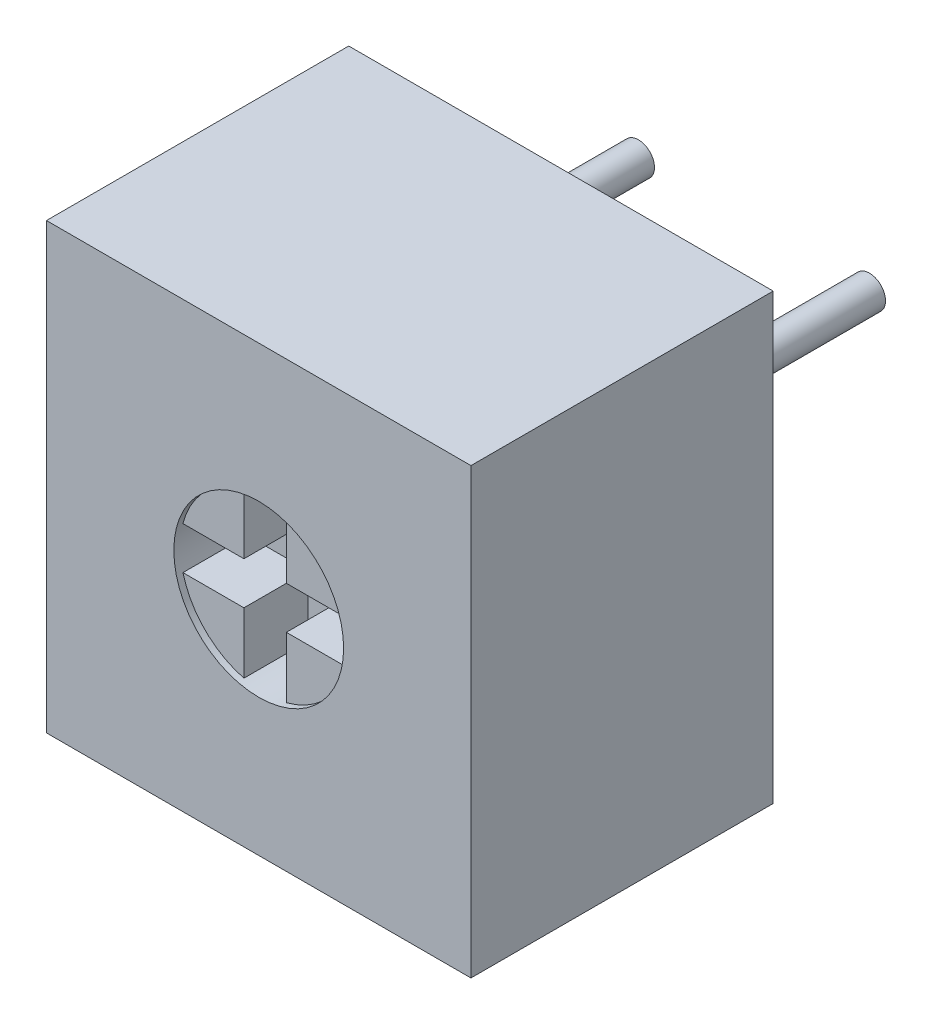
ISO-10303-21;
HEADER;
FILE_DESCRIPTION(('STEP AP214'),'2;1');
FILE_NAME('part.step','',(''),(''),'','','');
FILE_SCHEMA(('AUTOMOTIVE_DESIGN { 1 0 10303 214 1 1 1 1 }'));
ENDSEC;
DATA;
#1=APPLICATION_CONTEXT('core data for automotive mechanical design processes');
#2=APPLICATION_PROTOCOL_DEFINITION('international standard','automotive_design',2000,#1);
#3=PRODUCT_CONTEXT('',#1,'mechanical');
#4=PRODUCT('Part','Part','',(#3));
#5=PRODUCT_RELATED_PRODUCT_CATEGORY('part','',(#4));
#6=PRODUCT_DEFINITION_FORMATION('','',#4);
#7=PRODUCT_DEFINITION_CONTEXT('part definition',#1,'design');
#8=PRODUCT_DEFINITION('design','',#6,#7);
#9=PRODUCT_DEFINITION_SHAPE('','',#8);
#10=(LENGTH_UNIT() NAMED_UNIT(*) SI_UNIT(.MILLI.,.METRE.));
#11=(NAMED_UNIT(*) PLANE_ANGLE_UNIT() SI_UNIT($,.RADIAN.));
#12=(NAMED_UNIT(*) SI_UNIT($,.STERADIAN.) SOLID_ANGLE_UNIT());
#13=UNCERTAINTY_MEASURE_WITH_UNIT(LENGTH_MEASURE(1.E-05),#10,'distance_accuracy_value','');
#14=(GEOMETRIC_REPRESENTATION_CONTEXT(3) GLOBAL_UNCERTAINTY_ASSIGNED_CONTEXT((#13)) GLOBAL_UNIT_ASSIGNED_CONTEXT((#10,
#11,#12)) REPRESENTATION_CONTEXT('',''));
#15=CARTESIAN_POINT('',(0.,0.,0.));
#16=DIRECTION('',(0.,0.,1.));
#17=DIRECTION('',(1.,0.,0.));
#18=AXIS2_PLACEMENT_3D('',#15,#16,#17);
#19=CARTESIAN_POINT('',(0.,0.,4.6));
#20=DIRECTION('',(0.,0.,1.));
#21=DIRECTION('',(1.,0.,0.));
#22=AXIS2_PLACEMENT_3D('',#19,#20,#21);
#23=PLANE('',#22);
#24=DIRECTION('',(0.,-1.,0.));
#25=VECTOR('',#24,1.);
#26=CARTESIAN_POINT('',(-0.33,1.27808450424845,4.6));
#27=LINE('',#26,#25);
#28=CARTESIAN_POINT('',(-0.33,1.27808450424845,4.6));
#29=VERTEX_POINT('',#28);
#30=CARTESIAN_POINT('',(-0.33,0.33,4.6));
#31=VERTEX_POINT('',#30);
#32=EDGE_CURVE('E238',#29,#31,#27,.T.);
#33=ORIENTED_EDGE('',*,*,#32,.F.);
#34=CARTESIAN_POINT('',(0.,0.,4.6));
#35=DIRECTION('',(0.,0.,1.));
#36=DIRECTION('',(1.,0.,0.));
#37=AXIS2_PLACEMENT_3D('',#34,#35,#36);
#38=CIRCLE('',#37,1.32);
#39=CARTESIAN_POINT('',(-1.27808450424845,0.33,4.6));
#40=VERTEX_POINT('',#39);
#41=EDGE_CURVE('E171',#29,#40,#38,.T.);
#42=ORIENTED_EDGE('',*,*,#41,.T.);
#43=DIRECTION('',(-1.,0.,0.));
#44=VECTOR('',#43,1.);
#45=CARTESIAN_POINT('',(-0.33,0.33,4.6));
#46=LINE('',#45,#44);
#47=EDGE_CURVE('E241',#31,#40,#46,.T.);
#48=ORIENTED_EDGE('',*,*,#47,.F.);
#49=EDGE_LOOP('',(#33,#42,#48));
#50=FACE_BOUND('',#49,.T.);
#51=ADVANCED_FACE('F38',(#50),#23,.T.);
#52=DIRECTION('',(1.,0.,0.));
#53=VECTOR('',#52,1.);
#54=CARTESIAN_POINT('',(-1.27808450424845,-0.33,4.6));
#55=LINE('',#54,#53);
#56=CARTESIAN_POINT('',(-1.27808450424845,-0.33,4.6));
#57=VERTEX_POINT('',#56);
#58=CARTESIAN_POINT('',(-0.33,-0.33,4.6));
#59=VERTEX_POINT('',#58);
#60=EDGE_CURVE('E245',#57,#59,#55,.T.);
#61=ORIENTED_EDGE('',*,*,#60,.F.);
#62=CARTESIAN_POINT('',(-0.33,-1.27808450424845,4.6));
#63=VERTEX_POINT('',#62);
#64=EDGE_CURVE('E406',#57,#63,#38,.T.);
#65=ORIENTED_EDGE('',*,*,#64,.T.);
#66=DIRECTION('',(0.,-1.,0.));
#67=VECTOR('',#66,1.);
#68=CARTESIAN_POINT('',(-0.33,-0.33,4.6));
#69=LINE('',#68,#67);
#70=EDGE_CURVE('E249',#59,#63,#69,.T.);
#71=ORIENTED_EDGE('',*,*,#70,.F.);
#72=EDGE_LOOP('',(#61,#65,#71));
#73=FACE_BOUND('',#72,.T.);
#74=ADVANCED_FACE('F373',(#73),#23,.T.);
#75=DIRECTION('',(0.,1.,0.));
#76=VECTOR('',#75,1.);
#77=CARTESIAN_POINT('',(0.33,-1.27808450424845,4.6));
#78=LINE('',#77,#76);
#79=CARTESIAN_POINT('',(0.33,-1.27808450424845,4.6));
#80=VERTEX_POINT('',#79);
#81=CARTESIAN_POINT('',(0.33,-0.33,4.6));
#82=VERTEX_POINT('',#81);
#83=EDGE_CURVE('E253',#80,#82,#78,.T.);
#84=ORIENTED_EDGE('',*,*,#83,.F.);
#85=CARTESIAN_POINT('',(1.27808450424845,-0.33,4.6));
#86=VERTEX_POINT('',#85);
#87=EDGE_CURVE('E300',#80,#86,#38,.T.);
#88=ORIENTED_EDGE('',*,*,#87,.T.);
#89=DIRECTION('',(1.,0.,0.));
#90=VECTOR('',#89,1.);
#91=CARTESIAN_POINT('',(0.33,-0.33,4.6));
#92=LINE('',#91,#90);
#93=EDGE_CURVE('E257',#82,#86,#92,.T.);
#94=ORIENTED_EDGE('',*,*,#93,.F.);
#95=EDGE_LOOP('',(#84,#88,#94));
#96=FACE_BOUND('',#95,.T.);
#97=ADVANCED_FACE('F371',(#96),#23,.T.);
#98=CARTESIAN_POINT('',(3.3,-3.45,4.7));
#99=DIRECTION('',(-1.,0.,0.));
#100=DIRECTION('',(0.,0.,1.));
#101=AXIS2_PLACEMENT_3D('',#98,#99,#100);
#102=PLANE('',#101);
#103=DIRECTION('',(0.,1.,0.));
#104=VECTOR('',#103,1.);
#105=CARTESIAN_POINT('',(3.3,-3.45,0.));
#106=LINE('',#105,#104);
#107=CARTESIAN_POINT('',(3.3,-3.45,0.));
#108=VERTEX_POINT('',#107);
#109=CARTESIAN_POINT('',(3.3,3.45,0.));
#110=VERTEX_POINT('',#109);
#111=EDGE_CURVE('E299',#108,#110,#106,.T.);
#112=ORIENTED_EDGE('',*,*,#111,.T.);
#113=DIRECTION('',(0.,0.,-1.));
#114=VECTOR('',#113,1.);
#115=CARTESIAN_POINT('',(3.3,3.45,4.7));
#116=LINE('',#115,#114);
#117=CARTESIAN_POINT('',(3.3,3.45,4.7));
#118=VERTEX_POINT('',#117);
#119=EDGE_CURVE('E334',#118,#110,#116,.T.);
#120=ORIENTED_EDGE('',*,*,#119,.F.);
#121=DIRECTION('',(0.,1.,0.));
#122=VECTOR('',#121,1.);
#123=CARTESIAN_POINT('',(3.3,-3.45,4.7));
#124=LINE('',#123,#122);
#125=CARTESIAN_POINT('',(3.3,-3.45,4.7));
#126=VERTEX_POINT('',#125);
#127=EDGE_CURVE('E304',#126,#118,#124,.T.);
#128=ORIENTED_EDGE('',*,*,#127,.F.);
#129=DIRECTION('',(0.,0.,-1.));
#130=VECTOR('',#129,1.);
#131=CARTESIAN_POINT('',(3.3,-3.45,4.7));
#132=LINE('',#131,#130);
#133=EDGE_CURVE('E314',#126,#108,#132,.T.);
#134=ORIENTED_EDGE('',*,*,#133,.T.);
#135=EDGE_LOOP('',(#112,#120,#128,#134));
#136=FACE_BOUND('',#135,.T.);
#137=ADVANCED_FACE('F40',(#136),#102,.F.);
#138=CARTESIAN_POINT('',(-3.3,3.45,4.7));
#139=DIRECTION('',(0.,-1.,0.));
#140=DIRECTION('',(0.,0.,-1.));
#141=AXIS2_PLACEMENT_3D('',#138,#139,#140);
#142=PLANE('',#141);
#143=DIRECTION('',(-1.,0.,0.));
#144=VECTOR('',#143,1.);
#145=CARTESIAN_POINT('',(-3.3,3.45,0.));
#146=LINE('',#145,#144);
#147=CARTESIAN_POINT('',(-3.3,3.45,0.));
#148=VERTEX_POINT('',#147);
#149=EDGE_CURVE('E318',#110,#148,#146,.T.);
#150=ORIENTED_EDGE('',*,*,#149,.T.);
#151=DIRECTION('',(0.,0.,-1.));
#152=VECTOR('',#151,1.);
#153=CARTESIAN_POINT('',(-3.3,3.45,4.7));
#154=LINE('',#153,#152);
#155=CARTESIAN_POINT('',(-3.3,3.45,4.7));
#156=VERTEX_POINT('',#155);
#157=EDGE_CURVE('E331',#156,#148,#154,.T.);
#158=ORIENTED_EDGE('',*,*,#157,.F.);
#159=DIRECTION('',(-1.,0.,0.));
#160=VECTOR('',#159,1.);
#161=CARTESIAN_POINT('',(-3.3,3.45,4.7));
#162=LINE('',#161,#160);
#163=EDGE_CURVE('E92',#118,#156,#162,.T.);
#164=ORIENTED_EDGE('',*,*,#163,.F.);
#165=ORIENTED_EDGE('',*,*,#119,.T.);
#166=EDGE_LOOP('',(#150,#158,#164,#165));
#167=FACE_BOUND('',#166,.T.);
#168=ADVANCED_FACE('F364',(#167),#142,.F.);
#169=CARTESIAN_POINT('',(-3.3,-3.45,4.7));
#170=DIRECTION('',(1.,0.,0.));
#171=DIRECTION('',(0.,0.,-1.));
#172=AXIS2_PLACEMENT_3D('',#169,#170,#171);
#173=PLANE('',#172);
#174=DIRECTION('',(0.,-1.,0.));
#175=VECTOR('',#174,1.);
#176=CARTESIAN_POINT('',(-3.3,-3.45,0.));
#177=LINE('',#176,#175);
#178=CARTESIAN_POINT('',(-3.3,-3.45,0.));
#179=VERTEX_POINT('',#178);
#180=EDGE_CURVE('E321',#148,#179,#177,.T.);
#181=ORIENTED_EDGE('',*,*,#180,.T.);
#182=DIRECTION('',(0.,0.,-1.));
#183=VECTOR('',#182,1.);
#184=CARTESIAN_POINT('',(-3.3,-3.45,4.7));
#185=LINE('',#184,#183);
#186=CARTESIAN_POINT('',(-3.3,-3.45,4.7));
#187=VERTEX_POINT('',#186);
#188=EDGE_CURVE('E328',#187,#179,#185,.T.);
#189=ORIENTED_EDGE('',*,*,#188,.F.);
#190=DIRECTION('',(0.,-1.,0.));
#191=VECTOR('',#190,1.);
#192=CARTESIAN_POINT('',(-3.3,-3.45,4.7));
#193=LINE('',#192,#191);
#194=EDGE_CURVE('E309',#156,#187,#193,.T.);
#195=ORIENTED_EDGE('',*,*,#194,.F.);
#196=ORIENTED_EDGE('',*,*,#157,.T.);
#197=EDGE_LOOP('',(#181,#189,#195,#196));
#198=FACE_BOUND('',#197,.T.);
#199=ADVANCED_FACE('F363',(#198),#173,.F.);
#200=CARTESIAN_POINT('',(-3.3,-3.45,4.7));
#201=DIRECTION('',(0.,1.,0.));
#202=DIRECTION('',(0.,0.,1.));
#203=AXIS2_PLACEMENT_3D('',#200,#201,#202);
#204=PLANE('',#203);
#205=DIRECTION('',(1.,0.,0.));
#206=VECTOR('',#205,1.);
#207=CARTESIAN_POINT('',(-3.3,-3.45,0.));
#208=LINE('',#207,#206);
#209=EDGE_CURVE('E84',#179,#108,#208,.T.);
#210=ORIENTED_EDGE('',*,*,#209,.T.);
#211=ORIENTED_EDGE('',*,*,#133,.F.);
#212=DIRECTION('',(1.,0.,0.));
#213=VECTOR('',#212,1.);
#214=CARTESIAN_POINT('',(-3.3,-3.45,4.7));
#215=LINE('',#214,#213);
#216=EDGE_CURVE('E63',#187,#126,#215,.T.);
#217=ORIENTED_EDGE('',*,*,#216,.F.);
#218=ORIENTED_EDGE('',*,*,#188,.T.);
#219=EDGE_LOOP('',(#210,#211,#217,#218));
#220=FACE_BOUND('',#219,.T.);
#221=ADVANCED_FACE('F359',(#220),#204,.F.);
#222=CARTESIAN_POINT('',(0.,0.,4.7));
#223=DIRECTION('',(0.,0.,-1.));
#224=DIRECTION('',(-1.,0.,0.));
#225=AXIS2_PLACEMENT_3D('',#222,#223,#224);
#226=PLANE('',#225);
#227=CARTESIAN_POINT('',(0.,0.,4.7));
#228=DIRECTION('',(0.,0.,1.));
#229=DIRECTION('',(1.,0.,0.));
#230=AXIS2_PLACEMENT_3D('',#227,#228,#229);
#231=CIRCLE('',#230,1.32);
#232=CARTESIAN_POINT('',(1.32,0.,4.7));
#233=VERTEX_POINT('',#232);
#234=EDGE_CURVE('E266',#233,#233,#231,.T.);
#235=ORIENTED_EDGE('',*,*,#234,.F.);
#236=EDGE_LOOP('',(#235));
#237=FACE_BOUND('',#236,.T.);
#238=ORIENTED_EDGE('',*,*,#127,.T.);
#239=ORIENTED_EDGE('',*,*,#163,.T.);
#240=ORIENTED_EDGE('',*,*,#194,.T.);
#241=ORIENTED_EDGE('',*,*,#216,.T.);
#242=EDGE_LOOP('',(#238,#239,#240,#241));
#243=FACE_BOUND('',#242,.T.);
#244=ADVANCED_FACE('F349',(#237,#243),#226,.F.);
#245=CARTESIAN_POINT('',(0.,0.,0.));
#246=DIRECTION('',(0.,0.,-1.));
#247=DIRECTION('',(-1.,0.,0.));
#248=AXIS2_PLACEMENT_3D('',#245,#246,#247);
#249=PLANE('',#248);
#250=CARTESIAN_POINT('',(0.,-0.609999999999998,0.));
#251=DIRECTION('',(0.,0.,-1.));
#252=DIRECTION('',(-1.,0.,0.));
#253=AXIS2_PLACEMENT_3D('',#250,#251,#252);
#254=CIRCLE('',#253,0.25);
#255=CARTESIAN_POINT('',(-0.25,-0.609999999999998,0.));
#256=VERTEX_POINT('',#255);
#257=EDGE_CURVE('E11',#256,#256,#254,.T.);
#258=ORIENTED_EDGE('',*,*,#257,.F.);
#259=EDGE_LOOP('',(#258));
#260=FACE_BOUND('',#259,.T.);
#261=CARTESIAN_POINT('',(-1.79605,1.19,0.));
#262=DIRECTION('',(0.,0.,-1.));
#263=DIRECTION('',(-1.,0.,0.));
#264=AXIS2_PLACEMENT_3D('',#261,#262,#263);
#265=CIRCLE('',#264,0.25);
#266=CARTESIAN_POINT('',(-2.04605,1.19,0.));
#267=VERTEX_POINT('',#266);
#268=EDGE_CURVE('E47',#267,#267,#265,.T.);
#269=ORIENTED_EDGE('',*,*,#268,.F.);
#270=EDGE_LOOP('',(#269));
#271=FACE_BOUND('',#270,.T.);
#272=CARTESIAN_POINT('',(1.79605,1.19,0.));
#273=DIRECTION('',(0.,0.,-1.));
#274=DIRECTION('',(-1.,0.,0.));
#275=AXIS2_PLACEMENT_3D('',#272,#273,#274);
#276=CIRCLE('',#275,0.25);
#277=CARTESIAN_POINT('',(1.54605,1.19,0.));
#278=VERTEX_POINT('',#277);
#279=EDGE_CURVE('E337',#278,#278,#276,.T.);
#280=ORIENTED_EDGE('',*,*,#279,.F.);
#281=EDGE_LOOP('',(#280));
#282=FACE_BOUND('',#281,.T.);
#283=ORIENTED_EDGE('',*,*,#111,.F.);
#284=ORIENTED_EDGE('',*,*,#209,.F.);
#285=ORIENTED_EDGE('',*,*,#180,.F.);
#286=ORIENTED_EDGE('',*,*,#149,.F.);
#287=EDGE_LOOP('',(#283,#284,#285,#286));
#288=FACE_BOUND('',#287,.T.);
#289=ADVANCED_FACE('F346',(#260,#271,#282,#288),#249,.T.);
#290=CARTESIAN_POINT('',(0.,0.,4.6));
#291=DIRECTION('',(0.,0.,1.));
#292=DIRECTION('',(1.,0.,0.));
#293=AXIS2_PLACEMENT_3D('',#290,#291,#292);
#294=CYLINDRICAL_SURFACE('',#293,1.32);
#295=CARTESIAN_POINT('',(1.27808450424845,0.33,4.6));
#296=VERTEX_POINT('',#295);
#297=CARTESIAN_POINT('',(0.33,1.27808450424845,4.6));
#298=VERTEX_POINT('',#297);
#299=EDGE_CURVE('E295',#296,#298,#38,.T.);
#300=ORIENTED_EDGE('',*,*,#299,.F.);
#301=DIRECTION('',(0.,0.,1.));
#302=VECTOR('',#301,1.);
#303=CARTESIAN_POINT('',(1.27808450424845,0.33,3.6));
#304=LINE('',#303,#302);
#305=CARTESIAN_POINT('',(1.27808450424845,0.33,3.6));
#306=VERTEX_POINT('',#305);
#307=EDGE_CURVE('E270',#306,#296,#304,.T.);
#308=ORIENTED_EDGE('',*,*,#307,.F.);
#309=CARTESIAN_POINT('',(0.,0.,3.6));
#310=DIRECTION('',(0.,0.,1.));
#311=DIRECTION('',(-1.,0.,0.));
#312=AXIS2_PLACEMENT_3D('',#309,#310,#311);
#313=CIRCLE('',#312,1.32);
#314=CARTESIAN_POINT('',(1.27808450424845,-0.33,3.6));
#315=VERTEX_POINT('',#314);
#316=EDGE_CURVE('E229',#315,#306,#313,.T.);
#317=ORIENTED_EDGE('',*,*,#316,.F.);
#318=DIRECTION('',(0.,0.,1.));
#319=VECTOR('',#318,1.);
#320=CARTESIAN_POINT('',(1.27808450424845,-0.33,3.6));
#321=LINE('',#320,#319);
#322=EDGE_CURVE('E273',#315,#86,#321,.T.);
#323=ORIENTED_EDGE('',*,*,#322,.T.);
#324=ORIENTED_EDGE('',*,*,#87,.F.);
#325=DIRECTION('',(0.,0.,1.));
#326=VECTOR('',#325,1.);
#327=CARTESIAN_POINT('',(0.33,-1.27808450424845,3.6));
#328=LINE('',#327,#326);
#329=CARTESIAN_POINT('',(0.33,-1.27808450424845,3.6));
#330=VERTEX_POINT('',#329);
#331=EDGE_CURVE('E279',#330,#80,#328,.T.);
#332=ORIENTED_EDGE('',*,*,#331,.F.);
#333=CARTESIAN_POINT('',(0.,0.,3.6));
#334=DIRECTION('',(0.,0.,1.));
#335=DIRECTION('',(-1.,0.,0.));
#336=AXIS2_PLACEMENT_3D('',#333,#334,#335);
#337=CIRCLE('',#336,1.32);
#338=CARTESIAN_POINT('',(-0.33,-1.27808450424845,3.6));
#339=VERTEX_POINT('',#338);
#340=EDGE_CURVE('E217',#339,#330,#337,.T.);
#341=ORIENTED_EDGE('',*,*,#340,.F.);
#342=DIRECTION('',(0.,0.,1.));
#343=VECTOR('',#342,1.);
#344=CARTESIAN_POINT('',(-0.33,-1.27808450424845,3.6));
#345=LINE('',#344,#343);
#346=EDGE_CURVE('E282',#339,#63,#345,.T.);
#347=ORIENTED_EDGE('',*,*,#346,.T.);
#348=ORIENTED_EDGE('',*,*,#64,.F.);
#349=DIRECTION('',(0.,0.,1.));
#350=VECTOR('',#349,1.);
#351=CARTESIAN_POINT('',(-1.27808450424845,-0.33,3.6));
#352=LINE('',#351,#350);
#353=CARTESIAN_POINT('',(-1.27808450424845,-0.33,3.6));
#354=VERTEX_POINT('',#353);
#355=EDGE_CURVE('E287',#354,#57,#352,.T.);
#356=ORIENTED_EDGE('',*,*,#355,.F.);
#357=CARTESIAN_POINT('',(0.,0.,3.6));
#358=DIRECTION('',(0.,0.,1.));
#359=DIRECTION('',(-1.,0.,0.));
#360=AXIS2_PLACEMENT_3D('',#357,#358,#359);
#361=CIRCLE('',#360,1.32);
#362=CARTESIAN_POINT('',(-1.27808450424845,0.33,3.6));
#363=VERTEX_POINT('',#362);
#364=EDGE_CURVE('E205',#363,#354,#361,.T.);
#365=ORIENTED_EDGE('',*,*,#364,.F.);
#366=DIRECTION('',(0.,0.,1.));
#367=VECTOR('',#366,1.);
#368=CARTESIAN_POINT('',(-1.27808450424845,0.33,3.6));
#369=LINE('',#368,#367);
#370=EDGE_CURVE('E290',#363,#40,#369,.T.);
#371=ORIENTED_EDGE('',*,*,#370,.T.);
#372=ORIENTED_EDGE('',*,*,#41,.F.);
#373=DIRECTION('',(0.,0.,1.));
#374=VECTOR('',#373,1.);
#375=CARTESIAN_POINT('',(-0.33,1.27808450424845,3.6));
#376=LINE('',#375,#374);
#377=CARTESIAN_POINT('',(-0.33,1.27808450424845,3.6));
#378=VERTEX_POINT('',#377);
#379=EDGE_CURVE('E162',#378,#29,#376,.T.);
#380=ORIENTED_EDGE('',*,*,#379,.F.);
#381=CARTESIAN_POINT('',(0.,0.,3.6));
#382=DIRECTION('',(0.,0.,1.));
#383=DIRECTION('',(-1.,0.,0.));
#384=AXIS2_PLACEMENT_3D('',#381,#382,#383);
#385=CIRCLE('',#384,1.32);
#386=CARTESIAN_POINT('',(0.33,1.27808450424845,3.6));
#387=VERTEX_POINT('',#386);
#388=EDGE_CURVE('E168',#387,#378,#385,.T.);
#389=ORIENTED_EDGE('',*,*,#388,.F.);
#390=DIRECTION('',(0.,0.,1.));
#391=VECTOR('',#390,1.);
#392=CARTESIAN_POINT('',(0.33,1.27808450424845,3.6));
#393=LINE('',#392,#391);
#394=EDGE_CURVE('E263',#387,#298,#393,.T.);
#395=ORIENTED_EDGE('',*,*,#394,.T.);
#396=EDGE_LOOP('',(#300,#308,#317,#323,#324,#332,#341,#347,#348,#356,#365,#371,#372,#380,#389,#395));
#397=FACE_BOUND('',#396,.T.);
#398=ORIENTED_EDGE('',*,*,#234,.T.);
#399=EDGE_LOOP('',(#398));
#400=FACE_BOUND('',#399,.T.);
#401=ADVANCED_FACE('F165',(#397,#400),#294,.F.);
#402=DIRECTION('',(-1.,0.,0.));
#403=VECTOR('',#402,1.);
#404=CARTESIAN_POINT('',(1.27808450424845,0.33,4.6));
#405=LINE('',#404,#403);
#406=CARTESIAN_POINT('',(0.33,0.33,4.6));
#407=VERTEX_POINT('',#406);
#408=EDGE_CURVE('E54',#296,#407,#405,.T.);
#409=ORIENTED_EDGE('',*,*,#408,.F.);
#410=ORIENTED_EDGE('',*,*,#299,.T.);
#411=DIRECTION('',(0.,1.,0.));
#412=VECTOR('',#411,1.);
#413=CARTESIAN_POINT('',(0.33,0.33,4.6));
#414=LINE('',#413,#412);
#415=EDGE_CURVE('E192',#407,#298,#414,.T.);
#416=ORIENTED_EDGE('',*,*,#415,.F.);
#417=EDGE_LOOP('',(#409,#410,#416));
#418=FACE_BOUND('',#417,.T.);
#419=ADVANCED_FACE('F376',(#418),#23,.T.);
#420=CARTESIAN_POINT('',(0.33,0.33,3.6));
#421=DIRECTION('',(1.,0.,0.));
#422=DIRECTION('',(0.,0.,-1.));
#423=AXIS2_PLACEMENT_3D('',#420,#421,#422);
#424=PLANE('',#423);
#425=ORIENTED_EDGE('',*,*,#415,.T.);
#426=ORIENTED_EDGE('',*,*,#394,.F.);
#427=DIRECTION('',(0.,1.,0.));
#428=VECTOR('',#427,1.);
#429=CARTESIAN_POINT('',(0.33,0.33,3.6));
#430=LINE('',#429,#428);
#431=CARTESIAN_POINT('',(0.33,0.33,3.6));
#432=VERTEX_POINT('',#431);
#433=EDGE_CURVE('E177',#432,#387,#430,.T.);
#434=ORIENTED_EDGE('',*,*,#433,.F.);
#435=DIRECTION('',(0.,0.,1.));
#436=VECTOR('',#435,1.);
#437=CARTESIAN_POINT('',(0.33,0.33,3.6));
#438=LINE('',#437,#436);
#439=EDGE_CURVE('E267',#432,#407,#438,.T.);
#440=ORIENTED_EDGE('',*,*,#439,.T.);
#441=EDGE_LOOP('',(#425,#426,#434,#440));
#442=FACE_BOUND('',#441,.T.);
#443=ADVANCED_FACE('F384',(#442),#424,.F.);
#444=CARTESIAN_POINT('',(1.27808450424845,0.33,3.6));
#445=DIRECTION('',(0.,1.,0.));
#446=DIRECTION('',(0.,0.,1.));
#447=AXIS2_PLACEMENT_3D('',#444,#445,#446);
#448=PLANE('',#447);
#449=ORIENTED_EDGE('',*,*,#408,.T.);
#450=ORIENTED_EDGE('',*,*,#439,.F.);
#451=DIRECTION('',(-1.,0.,0.));
#452=VECTOR('',#451,1.);
#453=CARTESIAN_POINT('',(1.27808450424845,0.33,3.6));
#454=LINE('',#453,#452);
#455=EDGE_CURVE('E233',#306,#432,#454,.T.);
#456=ORIENTED_EDGE('',*,*,#455,.F.);
#457=ORIENTED_EDGE('',*,*,#307,.T.);
#458=EDGE_LOOP('',(#449,#450,#456,#457));
#459=FACE_BOUND('',#458,.T.);
#460=ADVANCED_FACE('F390',(#459),#448,.F.);
#461=CARTESIAN_POINT('',(0.33,-0.33,3.6));
#462=DIRECTION('',(0.,-1.,0.));
#463=DIRECTION('',(0.,0.,-1.));
#464=AXIS2_PLACEMENT_3D('',#461,#462,#463);
#465=PLANE('',#464);
#466=ORIENTED_EDGE('',*,*,#93,.T.);
#467=ORIENTED_EDGE('',*,*,#322,.F.);
#468=DIRECTION('',(1.,0.,0.));
#469=VECTOR('',#468,1.);
#470=CARTESIAN_POINT('',(0.33,-0.33,3.6));
#471=LINE('',#470,#469);
#472=CARTESIAN_POINT('',(0.33,-0.33,3.6));
#473=VERTEX_POINT('',#472);
#474=EDGE_CURVE('E225',#473,#315,#471,.T.);
#475=ORIENTED_EDGE('',*,*,#474,.F.);
#476=DIRECTION('',(0.,0.,1.));
#477=VECTOR('',#476,1.);
#478=CARTESIAN_POINT('',(0.33,-0.33,3.6));
#479=LINE('',#478,#477);
#480=EDGE_CURVE('E276',#473,#82,#479,.T.);
#481=ORIENTED_EDGE('',*,*,#480,.T.);
#482=EDGE_LOOP('',(#466,#467,#475,#481));
#483=FACE_BOUND('',#482,.T.);
#484=ADVANCED_FACE('F426',(#483),#465,.F.);
#485=CARTESIAN_POINT('',(0.33,-1.27808450424845,3.6));
#486=DIRECTION('',(1.,0.,0.));
#487=DIRECTION('',(0.,0.,-1.));
#488=AXIS2_PLACEMENT_3D('',#485,#486,#487);
#489=PLANE('',#488);
#490=ORIENTED_EDGE('',*,*,#83,.T.);
#491=ORIENTED_EDGE('',*,*,#480,.F.);
#492=DIRECTION('',(0.,1.,0.));
#493=VECTOR('',#492,1.);
#494=CARTESIAN_POINT('',(0.33,-1.27808450424845,3.6));
#495=LINE('',#494,#493);
#496=EDGE_CURVE('E221',#330,#473,#495,.T.);
#497=ORIENTED_EDGE('',*,*,#496,.F.);
#498=ORIENTED_EDGE('',*,*,#331,.T.);
#499=EDGE_LOOP('',(#490,#491,#497,#498));
#500=FACE_BOUND('',#499,.T.);
#501=ADVANCED_FACE('F424',(#500),#489,.F.);
#502=CARTESIAN_POINT('',(-0.33,-0.33,3.6));
#503=DIRECTION('',(-1.,0.,0.));
#504=DIRECTION('',(0.,0.,1.));
#505=AXIS2_PLACEMENT_3D('',#502,#503,#504);
#506=PLANE('',#505);
#507=ORIENTED_EDGE('',*,*,#70,.T.);
#508=ORIENTED_EDGE('',*,*,#346,.F.);
#509=DIRECTION('',(0.,-1.,0.));
#510=VECTOR('',#509,1.);
#511=CARTESIAN_POINT('',(-0.33,-0.33,3.6));
#512=LINE('',#511,#510);
#513=CARTESIAN_POINT('',(-0.33,-0.33,3.6));
#514=VERTEX_POINT('',#513);
#515=EDGE_CURVE('E213',#514,#339,#512,.T.);
#516=ORIENTED_EDGE('',*,*,#515,.F.);
#517=DIRECTION('',(0.,0.,1.));
#518=VECTOR('',#517,1.);
#519=CARTESIAN_POINT('',(-0.33,-0.33,3.6));
#520=LINE('',#519,#518);
#521=EDGE_CURVE('E284',#514,#59,#520,.T.);
#522=ORIENTED_EDGE('',*,*,#521,.T.);
#523=EDGE_LOOP('',(#507,#508,#516,#522));
#524=FACE_BOUND('',#523,.T.);
#525=ADVANCED_FACE('F422',(#524),#506,.F.);
#526=CARTESIAN_POINT('',(-1.27808450424845,-0.33,3.6));
#527=DIRECTION('',(0.,-1.,0.));
#528=DIRECTION('',(0.,0.,-1.));
#529=AXIS2_PLACEMENT_3D('',#526,#527,#528);
#530=PLANE('',#529);
#531=ORIENTED_EDGE('',*,*,#60,.T.);
#532=ORIENTED_EDGE('',*,*,#521,.F.);
#533=DIRECTION('',(1.,0.,0.));
#534=VECTOR('',#533,1.);
#535=CARTESIAN_POINT('',(-1.27808450424845,-0.33,3.6));
#536=LINE('',#535,#534);
#537=EDGE_CURVE('E209',#354,#514,#536,.T.);
#538=ORIENTED_EDGE('',*,*,#537,.F.);
#539=ORIENTED_EDGE('',*,*,#355,.T.);
#540=EDGE_LOOP('',(#531,#532,#538,#539));
#541=FACE_BOUND('',#540,.T.);
#542=ADVANCED_FACE('F419',(#541),#530,.F.);
#543=CARTESIAN_POINT('',(-0.33,0.33,3.6));
#544=DIRECTION('',(0.,1.,0.));
#545=DIRECTION('',(0.,0.,1.));
#546=AXIS2_PLACEMENT_3D('',#543,#544,#545);
#547=PLANE('',#546);
#548=ORIENTED_EDGE('',*,*,#47,.T.);
#549=ORIENTED_EDGE('',*,*,#370,.F.);
#550=DIRECTION('',(-1.,0.,0.));
#551=VECTOR('',#550,1.);
#552=CARTESIAN_POINT('',(-0.33,0.33,3.6));
#553=LINE('',#552,#551);
#554=CARTESIAN_POINT('',(-0.33,0.33,3.6));
#555=VERTEX_POINT('',#554);
#556=EDGE_CURVE('E186',#555,#363,#553,.T.);
#557=ORIENTED_EDGE('',*,*,#556,.F.);
#558=DIRECTION('',(0.,0.,1.));
#559=VECTOR('',#558,1.);
#560=CARTESIAN_POINT('',(-0.33,0.33,3.6));
#561=LINE('',#560,#559);
#562=EDGE_CURVE('E176',#555,#31,#561,.T.);
#563=ORIENTED_EDGE('',*,*,#562,.T.);
#564=EDGE_LOOP('',(#548,#549,#557,#563));
#565=FACE_BOUND('',#564,.T.);
#566=ADVANCED_FACE('F415',(#565),#547,.F.);
#567=CARTESIAN_POINT('',(-0.33,1.27808450424845,3.6));
#568=DIRECTION('',(-1.,0.,0.));
#569=DIRECTION('',(0.,0.,1.));
#570=AXIS2_PLACEMENT_3D('',#567,#568,#569);
#571=PLANE('',#570);
#572=ORIENTED_EDGE('',*,*,#32,.T.);
#573=ORIENTED_EDGE('',*,*,#562,.F.);
#574=DIRECTION('',(0.,-1.,0.));
#575=VECTOR('',#574,1.);
#576=CARTESIAN_POINT('',(-0.33,1.27808450424845,3.6));
#577=LINE('',#576,#575);
#578=EDGE_CURVE('E180',#378,#555,#577,.T.);
#579=ORIENTED_EDGE('',*,*,#578,.F.);
#580=ORIENTED_EDGE('',*,*,#379,.T.);
#581=EDGE_LOOP('',(#572,#573,#579,#580));
#582=FACE_BOUND('',#581,.T.);
#583=ADVANCED_FACE('F181',(#582),#571,.F.);
#584=CARTESIAN_POINT('',(0.,0.,3.6));
#585=DIRECTION('',(0.,0.,-1.));
#586=DIRECTION('',(-1.,0.,0.));
#587=AXIS2_PLACEMENT_3D('',#584,#585,#586);
#588=PLANE('',#587);
#589=ORIENTED_EDGE('',*,*,#388,.T.);
#590=ORIENTED_EDGE('',*,*,#578,.T.);
#591=ORIENTED_EDGE('',*,*,#556,.T.);
#592=ORIENTED_EDGE('',*,*,#364,.T.);
#593=ORIENTED_EDGE('',*,*,#537,.T.);
#594=ORIENTED_EDGE('',*,*,#515,.T.);
#595=ORIENTED_EDGE('',*,*,#340,.T.);
#596=ORIENTED_EDGE('',*,*,#496,.T.);
#597=ORIENTED_EDGE('',*,*,#474,.T.);
#598=ORIENTED_EDGE('',*,*,#316,.T.);
#599=ORIENTED_EDGE('',*,*,#455,.T.);
#600=ORIENTED_EDGE('',*,*,#433,.T.);
#601=EDGE_LOOP('',(#589,#590,#591,#592,#593,#594,#595,#596,#597,#598,#599,#600));
#602=FACE_BOUND('',#601,.T.);
#603=ADVANCED_FACE('F188',(#602),#588,.F.);
#604=CARTESIAN_POINT('',(1.79605,1.19,-3.));
#605=DIRECTION('',(0.,0.,1.));
#606=DIRECTION('',(1.,0.,0.));
#607=AXIS2_PLACEMENT_3D('',#604,#605,#606);
#608=CYLINDRICAL_SURFACE('',#607,0.25);
#609=CARTESIAN_POINT('',(1.79605,1.19,-3.));
#610=DIRECTION('',(0.,0.,1.));
#611=DIRECTION('',(1.,0.,0.));
#612=AXIS2_PLACEMENT_3D('',#609,#610,#611);
#613=CIRCLE('',#612,0.25);
#614=CARTESIAN_POINT('',(2.04605,1.19,-3.));
#615=VERTEX_POINT('',#614);
#616=EDGE_CURVE('E200',#615,#615,#613,.T.);
#617=ORIENTED_EDGE('',*,*,#616,.T.);
#618=EDGE_LOOP('',(#617));
#619=FACE_BOUND('',#618,.T.);
#620=ORIENTED_EDGE('',*,*,#279,.T.);
#621=EDGE_LOOP('',(#620));
#622=FACE_BOUND('',#621,.T.);
#623=ADVANCED_FACE('F448',(#619,#622),#608,.T.);
#624=CARTESIAN_POINT('',(1.79605,1.19,-3.));
#625=DIRECTION('',(0.,0.,1.));
#626=DIRECTION('',(1.,0.,0.));
#627=AXIS2_PLACEMENT_3D('',#624,#625,#626);
#628=PLANE('',#627);
#629=ORIENTED_EDGE('',*,*,#616,.F.);
#630=EDGE_LOOP('',(#629));
#631=FACE_BOUND('',#630,.T.);
#632=ADVANCED_FACE('F452',(#631),#628,.F.);
#633=CARTESIAN_POINT('',(-1.79605,1.19,-3.));
#634=DIRECTION('',(0.,0.,1.));
#635=DIRECTION('',(1.,0.,0.));
#636=AXIS2_PLACEMENT_3D('',#633,#634,#635);
#637=CYLINDRICAL_SURFACE('',#636,0.25);
#638=CARTESIAN_POINT('',(-1.79605,1.19,-3.));
#639=DIRECTION('',(0.,0.,1.));
#640=DIRECTION('',(1.,0.,0.));
#641=AXIS2_PLACEMENT_3D('',#638,#639,#640);
#642=CIRCLE('',#641,0.25);
#643=CARTESIAN_POINT('',(-1.54605,1.19,-3.));
#644=VERTEX_POINT('',#643);
#645=EDGE_CURVE('E479',#644,#644,#642,.T.);
#646=ORIENTED_EDGE('',*,*,#645,.T.);
#647=EDGE_LOOP('',(#646));
#648=FACE_BOUND('',#647,.T.);
#649=ORIENTED_EDGE('',*,*,#268,.T.);
#650=EDGE_LOOP('',(#649));
#651=FACE_BOUND('',#650,.T.);
#652=ADVANCED_FACE('F344',(#648,#651),#637,.T.);
#653=CARTESIAN_POINT('',(-1.79605,1.19,-3.));
#654=DIRECTION('',(0.,0.,1.));
#655=DIRECTION('',(1.,0.,0.));
#656=AXIS2_PLACEMENT_3D('',#653,#654,#655);
#657=PLANE('',#656);
#658=ORIENTED_EDGE('',*,*,#645,.F.);
#659=EDGE_LOOP('',(#658));
#660=FACE_BOUND('',#659,.T.);
#661=ADVANCED_FACE('F461',(#660),#657,.F.);
#662=CARTESIAN_POINT('',(0.,-0.609999999999998,-3.));
#663=DIRECTION('',(0.,0.,1.));
#664=DIRECTION('',(1.,0.,0.));
#665=AXIS2_PLACEMENT_3D('',#662,#663,#664);
#666=CYLINDRICAL_SURFACE('',#665,0.25);
#667=CARTESIAN_POINT('',(0.,-0.609999999999998,-3.));
#668=DIRECTION('',(0.,0.,1.));
#669=DIRECTION('',(1.,0.,0.));
#670=AXIS2_PLACEMENT_3D('',#667,#668,#669);
#671=CIRCLE('',#670,0.25);
#672=CARTESIAN_POINT('',(0.25,-0.609999999999998,-3.));
#673=VERTEX_POINT('',#672);
#674=EDGE_CURVE('E477',#673,#673,#671,.T.);
#675=ORIENTED_EDGE('',*,*,#674,.T.);
#676=EDGE_LOOP('',(#675));
#677=FACE_BOUND('',#676,.T.);
#678=ORIENTED_EDGE('',*,*,#257,.T.);
#679=EDGE_LOOP('',(#678));
#680=FACE_BOUND('',#679,.T.);
#681=ADVANCED_FACE('F465',(#677,#680),#666,.T.);
#682=CARTESIAN_POINT('',(0.,-0.609999999999998,-3.));
#683=DIRECTION('',(0.,0.,1.));
#684=DIRECTION('',(1.,0.,0.));
#685=AXIS2_PLACEMENT_3D('',#682,#683,#684);
#686=PLANE('',#685);
#687=ORIENTED_EDGE('',*,*,#674,.F.);
#688=EDGE_LOOP('',(#687));
#689=FACE_BOUND('',#688,.T.);
#690=ADVANCED_FACE('F469',(#689),#686,.F.);
#691=CLOSED_SHELL('',(#51,#74,#97,#137,#168,#199,#221,#244,#289,#401,#419,#443,#460,#484,#501,
#525,#542,#566,#583,#603,#623,#632,#652,#661,#681,#690));
#692=MANIFOLD_SOLID_BREP('B2',#691);
#693=ADVANCED_BREP_SHAPE_REPRESENTATION('',(#18,#692),#14);
#694=SHAPE_DEFINITION_REPRESENTATION(#9,#693);
ENDSEC;
END-ISO-10303-21;
